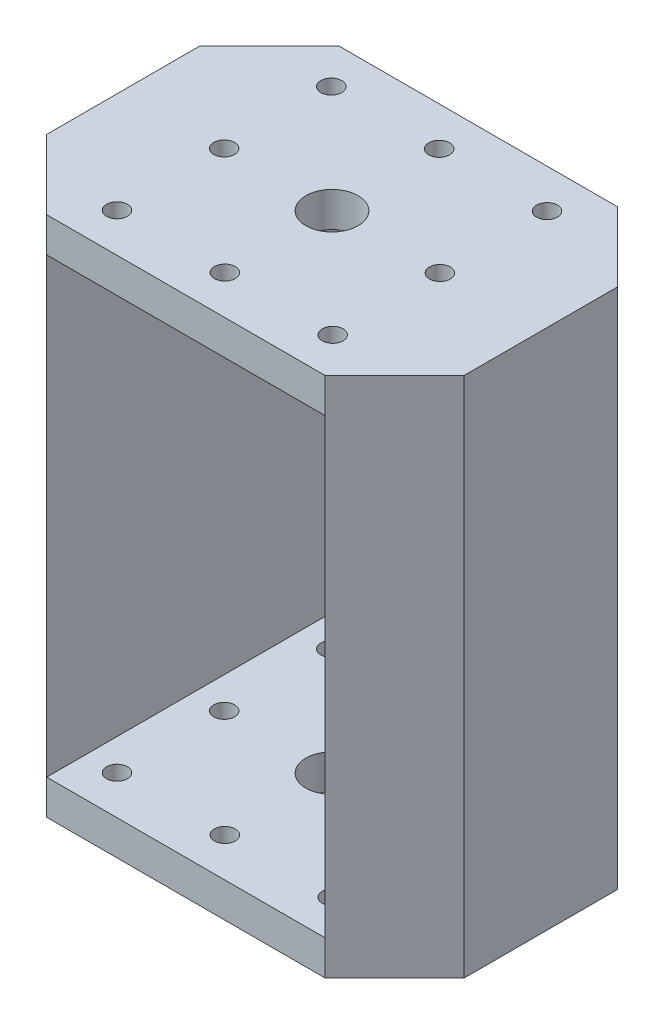
ISO-10303-21;
HEADER;
FILE_DESCRIPTION(('STEP AP214'),'2;1');
FILE_NAME('part.step','',(''),(''),'','','');
FILE_SCHEMA(('AUTOMOTIVE_DESIGN { 1 0 10303 214 1 1 1 1 }'));
ENDSEC;
DATA;
#1=APPLICATION_CONTEXT('core data for automotive mechanical design processes');
#2=APPLICATION_PROTOCOL_DEFINITION('international standard','automotive_design',2000,#1);
#3=PRODUCT_CONTEXT('',#1,'mechanical');
#4=PRODUCT('Part','Part','',(#3));
#5=PRODUCT_RELATED_PRODUCT_CATEGORY('part','',(#4));
#6=PRODUCT_DEFINITION_FORMATION('','',#4);
#7=PRODUCT_DEFINITION_CONTEXT('part definition',#1,'design');
#8=PRODUCT_DEFINITION('design','',#6,#7);
#9=PRODUCT_DEFINITION_SHAPE('','',#8);
#10=(LENGTH_UNIT() NAMED_UNIT(*) SI_UNIT(.MILLI.,.METRE.));
#11=(NAMED_UNIT(*) PLANE_ANGLE_UNIT() SI_UNIT($,.RADIAN.));
#12=(NAMED_UNIT(*) SI_UNIT($,.STERADIAN.) SOLID_ANGLE_UNIT());
#13=UNCERTAINTY_MEASURE_WITH_UNIT(LENGTH_MEASURE(1.E-05),#10,'distance_accuracy_value','');
#14=(GEOMETRIC_REPRESENTATION_CONTEXT(3) GLOBAL_UNCERTAINTY_ASSIGNED_CONTEXT((#13)) GLOBAL_UNIT_ASSIGNED_CONTEXT((#10,
#11,#12)) REPRESENTATION_CONTEXT('',''));
#15=CARTESIAN_POINT('',(0.,0.,0.));
#16=DIRECTION('',(0.,0.,1.));
#17=DIRECTION('',(1.,0.,0.));
#18=AXIS2_PLACEMENT_3D('',#15,#16,#17);
#19=CARTESIAN_POINT('',(0.,75.,0.));
#20=DIRECTION('',(0.,0.,-1.));
#21=DIRECTION('',(-1.,0.,0.));
#22=AXIS2_PLACEMENT_3D('',#19,#20,#21);
#23=PLANE('',#22);
#24=DIRECTION('',(1.,0.,0.));
#25=VECTOR('',#24,1.);
#26=CARTESIAN_POINT('',(0.,0.,0.));
#27=LINE('',#26,#25);
#28=CARTESIAN_POINT('',(9.99999999999999,0.,0.));
#29=VERTEX_POINT('',#28);
#30=CARTESIAN_POINT('',(50.,0.,0.));
#31=VERTEX_POINT('',#30);
#32=EDGE_CURVE('E247',#29,#31,#27,.T.);
#33=ORIENTED_EDGE('',*,*,#32,.T.);
#34=DIRECTION('',(0.,1.,0.));
#35=VECTOR('',#34,1.);
#36=CARTESIAN_POINT('',(50.,75.,0.));
#37=LINE('',#36,#35);
#38=CARTESIAN_POINT('',(50.,5.,0.));
#39=VERTEX_POINT('',#38);
#40=EDGE_CURVE('E227',#31,#39,#37,.T.);
#41=ORIENTED_EDGE('',*,*,#40,.T.);
#42=DIRECTION('',(-1.,0.,0.));
#43=VECTOR('',#42,1.);
#44=CARTESIAN_POINT('',(0.,5.,0.));
#45=LINE('',#44,#43);
#46=CARTESIAN_POINT('',(10.,5.,0.));
#47=VERTEX_POINT('',#46);
#48=EDGE_CURVE('E272',#39,#47,#45,.T.);
#49=ORIENTED_EDGE('',*,*,#48,.T.);
#50=DIRECTION('',(0.,-1.,0.));
#51=VECTOR('',#50,1.);
#52=CARTESIAN_POINT('',(9.99999999999999,75.,0.));
#53=LINE('',#52,#51);
#54=EDGE_CURVE('E218',#47,#29,#53,.T.);
#55=ORIENTED_EDGE('',*,*,#54,.T.);
#56=EDGE_LOOP('',(#33,#41,#49,#55));
#57=FACE_BOUND('',#56,.T.);
#58=ADVANCED_FACE('F47',(#57),#23,.F.);
#59=CARTESIAN_POINT('',(0.,75.,-42.));
#60=DIRECTION('',(0.,0.,1.));
#61=DIRECTION('',(1.,0.,0.));
#62=AXIS2_PLACEMENT_3D('',#59,#60,#61);
#63=PLANE('',#62);
#64=DIRECTION('',(-1.,0.,0.));
#65=VECTOR('',#64,1.);
#66=CARTESIAN_POINT('',(0.,75.,-42.));
#67=LINE('',#66,#65);
#68=CARTESIAN_POINT('',(50.,75.,-42.));
#69=VERTEX_POINT('',#68);
#70=CARTESIAN_POINT('',(10.,75.,-42.));
#71=VERTEX_POINT('',#70);
#72=EDGE_CURVE('E290',#69,#71,#67,.T.);
#73=ORIENTED_EDGE('',*,*,#72,.F.);
#74=DIRECTION('',(0.,-1.,0.));
#75=VECTOR('',#74,1.);
#76=CARTESIAN_POINT('',(50.,75.,-42.));
#77=LINE('',#76,#75);
#78=CARTESIAN_POINT('',(50.,70.,-42.));
#79=VERTEX_POINT('',#78);
#80=EDGE_CURVE('E146',#69,#79,#77,.T.);
#81=ORIENTED_EDGE('',*,*,#80,.T.);
#82=DIRECTION('',(1.,0.,0.));
#83=VECTOR('',#82,1.);
#84=CARTESIAN_POINT('',(60.,70.,-42.));
#85=LINE('',#84,#83);
#86=CARTESIAN_POINT('',(10.,70.,-42.));
#87=VERTEX_POINT('',#86);
#88=EDGE_CURVE('E138',#87,#79,#85,.T.);
#89=ORIENTED_EDGE('',*,*,#88,.F.);
#90=DIRECTION('',(0.,1.,0.));
#91=VECTOR('',#90,1.);
#92=CARTESIAN_POINT('',(10.,75.,-42.));
#93=LINE('',#92,#91);
#94=EDGE_CURVE('E143',#87,#71,#93,.T.);
#95=ORIENTED_EDGE('',*,*,#94,.T.);
#96=EDGE_LOOP('',(#73,#81,#89,#95));
#97=FACE_BOUND('',#96,.T.);
#98=ADVANCED_FACE('F141',(#97),#63,.F.);
#99=CARTESIAN_POINT('',(60.,70.,0.));
#100=DIRECTION('',(0.,1.,0.));
#101=DIRECTION('',(0.,0.,1.));
#102=AXIS2_PLACEMENT_3D('',#99,#100,#101);
#103=PLANE('',#102);
#104=CARTESIAN_POINT('',(14.5,70.,-21.));
#105=DIRECTION('',(0.,1.,0.));
#106=DIRECTION('',(0.,0.,1.));
#107=AXIS2_PLACEMENT_3D('',#104,#105,#106);
#108=CIRCLE('',#107,1.5);
#109=CARTESIAN_POINT('',(14.5,70.,-19.5));
#110=VERTEX_POINT('',#109);
#111=EDGE_CURVE('E151',#110,#110,#108,.T.);
#112=ORIENTED_EDGE('',*,*,#111,.T.);
#113=EDGE_LOOP('',(#112));
#114=FACE_BOUND('',#113,.T.);
#115=CARTESIAN_POINT('',(30.,70.,-5.6));
#116=DIRECTION('',(0.,1.,0.));
#117=DIRECTION('',(0.,0.,1.));
#118=AXIS2_PLACEMENT_3D('',#115,#116,#117);
#119=CIRCLE('',#118,1.5);
#120=CARTESIAN_POINT('',(30.,70.,-4.1));
#121=VERTEX_POINT('',#120);
#122=EDGE_CURVE('E289',#121,#121,#119,.T.);
#123=ORIENTED_EDGE('',*,*,#122,.T.);
#124=EDGE_LOOP('',(#123));
#125=FACE_BOUND('',#124,.T.);
#126=CARTESIAN_POINT('',(45.5,70.,-21.));
#127=DIRECTION('',(0.,1.,0.));
#128=DIRECTION('',(0.,0.,1.));
#129=AXIS2_PLACEMENT_3D('',#126,#127,#128);
#130=CIRCLE('',#129,1.5);
#131=CARTESIAN_POINT('',(45.5,70.,-19.5));
#132=VERTEX_POINT('',#131);
#133=EDGE_CURVE('E362',#132,#132,#130,.T.);
#134=ORIENTED_EDGE('',*,*,#133,.T.);
#135=EDGE_LOOP('',(#134));
#136=FACE_BOUND('',#135,.T.);
#137=CARTESIAN_POINT('',(30.,70.,-36.4));
#138=DIRECTION('',(0.,1.,0.));
#139=DIRECTION('',(0.,0.,1.));
#140=AXIS2_PLACEMENT_3D('',#137,#138,#139);
#141=CIRCLE('',#140,1.49999999999999);
#142=CARTESIAN_POINT('',(30.,70.,-34.9));
#143=VERTEX_POINT('',#142);
#144=EDGE_CURVE('E358',#143,#143,#141,.T.);
#145=ORIENTED_EDGE('',*,*,#144,.T.);
#146=EDGE_LOOP('',(#145));
#147=FACE_BOUND('',#146,.T.);
#148=CARTESIAN_POINT('',(14.5,70.,-5.6));
#149=DIRECTION('',(0.,1.,0.));
#150=DIRECTION('',(0.,0.,1.));
#151=AXIS2_PLACEMENT_3D('',#148,#149,#150);
#152=CIRCLE('',#151,1.5);
#153=CARTESIAN_POINT('',(14.5,70.,-4.1));
#154=VERTEX_POINT('',#153);
#155=EDGE_CURVE('E354',#154,#154,#152,.T.);
#156=ORIENTED_EDGE('',*,*,#155,.T.);
#157=EDGE_LOOP('',(#156));
#158=FACE_BOUND('',#157,.T.);
#159=CARTESIAN_POINT('',(45.5,70.,-5.6));
#160=DIRECTION('',(0.,1.,0.));
#161=DIRECTION('',(0.,0.,1.));
#162=AXIS2_PLACEMENT_3D('',#159,#160,#161);
#163=CIRCLE('',#162,1.5);
#164=CARTESIAN_POINT('',(45.5,70.,-4.1));
#165=VERTEX_POINT('',#164);
#166=EDGE_CURVE('E350',#165,#165,#163,.T.);
#167=ORIENTED_EDGE('',*,*,#166,.T.);
#168=EDGE_LOOP('',(#167));
#169=FACE_BOUND('',#168,.T.);
#170=CARTESIAN_POINT('',(45.5,70.,-36.4));
#171=DIRECTION('',(0.,1.,0.));
#172=DIRECTION('',(0.,0.,1.));
#173=AXIS2_PLACEMENT_3D('',#170,#171,#172);
#174=CIRCLE('',#173,1.5);
#175=CARTESIAN_POINT('',(45.5,70.,-34.9));
#176=VERTEX_POINT('',#175);
#177=EDGE_CURVE('E346',#176,#176,#174,.T.);
#178=ORIENTED_EDGE('',*,*,#177,.T.);
#179=EDGE_LOOP('',(#178));
#180=FACE_BOUND('',#179,.T.);
#181=CARTESIAN_POINT('',(14.5,70.,-36.4));
#182=DIRECTION('',(0.,1.,0.));
#183=DIRECTION('',(0.,0.,1.));
#184=AXIS2_PLACEMENT_3D('',#181,#182,#183);
#185=CIRCLE('',#184,1.5);
#186=CARTESIAN_POINT('',(14.5,70.,-34.9));
#187=VERTEX_POINT('',#186);
#188=EDGE_CURVE('E342',#187,#187,#185,.T.);
#189=ORIENTED_EDGE('',*,*,#188,.T.);
#190=EDGE_LOOP('',(#189));
#191=FACE_BOUND('',#190,.T.);
#192=CARTESIAN_POINT('',(30.,70.,-21.));
#193=DIRECTION('',(0.,1.,0.));
#194=DIRECTION('',(0.,0.,1.));
#195=AXIS2_PLACEMENT_3D('',#192,#193,#194);
#196=CIRCLE('',#195,3.75000000000001);
#197=CARTESIAN_POINT('',(30.,70.,-17.25));
#198=VERTEX_POINT('',#197);
#199=EDGE_CURVE('E293',#198,#198,#196,.T.);
#200=ORIENTED_EDGE('',*,*,#199,.T.);
#201=EDGE_LOOP('',(#200));
#202=FACE_BOUND('',#201,.T.);
#203=DIRECTION('',(1.,0.,0.));
#204=VECTOR('',#203,1.);
#205=CARTESIAN_POINT('',(60.,70.,0.));
#206=LINE('',#205,#204);
#207=CARTESIAN_POINT('',(10.,70.,0.));
#208=VERTEX_POINT('',#207);
#209=CARTESIAN_POINT('',(50.,70.,0.));
#210=VERTEX_POINT('',#209);
#211=EDGE_CURVE('E158',#208,#210,#206,.T.);
#212=ORIENTED_EDGE('',*,*,#211,.F.);
#213=DIRECTION('',(0.,0.,1.));
#214=VECTOR('',#213,1.);
#215=CARTESIAN_POINT('',(10.,70.,-42.));
#216=LINE('',#215,#214);
#217=EDGE_CURVE('E155',#87,#208,#216,.T.);
#218=ORIENTED_EDGE('',*,*,#217,.F.);
#219=ORIENTED_EDGE('',*,*,#88,.T.);
#220=DIRECTION('',(0.,0.,-1.));
#221=VECTOR('',#220,1.);
#222=CARTESIAN_POINT('',(50.,70.,0.));
#223=LINE('',#222,#221);
#224=EDGE_CURVE('E283',#210,#79,#223,.T.);
#225=ORIENTED_EDGE('',*,*,#224,.F.);
#226=EDGE_LOOP('',(#212,#218,#219,#225));
#227=FACE_BOUND('',#226,.T.);
#228=ADVANCED_FACE('F157',(#114,#125,#136,#147,#158,#169,#180,#191,#202,#227),#103,.F.);
#229=CARTESIAN_POINT('',(0.,75.,0.));
#230=DIRECTION('',(1.,0.,0.));
#231=DIRECTION('',(0.,0.,-1.));
#232=AXIS2_PLACEMENT_3D('',#229,#230,#231);
#233=PLANE('',#232);
#234=DIRECTION('',(0.,0.,1.));
#235=VECTOR('',#234,1.);
#236=CARTESIAN_POINT('',(0.,0.,0.));
#237=LINE('',#236,#235);
#238=CARTESIAN_POINT('',(0.,0.,-32.));
#239=VERTEX_POINT('',#238);
#240=CARTESIAN_POINT('',(0.,0.,-10.));
#241=VERTEX_POINT('',#240);
#242=EDGE_CURVE('E236',#239,#241,#237,.T.);
#243=ORIENTED_EDGE('',*,*,#242,.T.);
#244=DIRECTION('',(0.,1.,0.));
#245=VECTOR('',#244,1.);
#246=CARTESIAN_POINT('',(0.,75.,-10.));
#247=LINE('',#246,#245);
#248=CARTESIAN_POINT('',(0.,75.,-10.));
#249=VERTEX_POINT('',#248);
#250=EDGE_CURVE('E11',#241,#249,#247,.T.);
#251=ORIENTED_EDGE('',*,*,#250,.T.);
#252=DIRECTION('',(0.,0.,1.));
#253=VECTOR('',#252,1.);
#254=CARTESIAN_POINT('',(0.,75.,0.));
#255=LINE('',#254,#253);
#256=CARTESIAN_POINT('',(0.,75.,-32.));
#257=VERTEX_POINT('',#256);
#258=EDGE_CURVE('E238',#257,#249,#255,.T.);
#259=ORIENTED_EDGE('',*,*,#258,.F.);
#260=DIRECTION('',(0.,-1.,0.));
#261=VECTOR('',#260,1.);
#262=CARTESIAN_POINT('',(0.,75.,-32.));
#263=LINE('',#262,#261);
#264=EDGE_CURVE('E57',#257,#239,#263,.T.);
#265=ORIENTED_EDGE('',*,*,#264,.T.);
#266=EDGE_LOOP('',(#243,#251,#259,#265));
#267=FACE_BOUND('',#266,.T.);
#268=ADVANCED_FACE('F235',(#267),#233,.F.);
#269=ORIENTED_EDGE('',*,*,#211,.T.);
#270=DIRECTION('',(0.,1.,0.));
#271=VECTOR('',#270,1.);
#272=CARTESIAN_POINT('',(50.,75.,0.));
#273=LINE('',#272,#271);
#274=CARTESIAN_POINT('',(50.,75.,0.));
#275=VERTEX_POINT('',#274);
#276=EDGE_CURVE('E64',#210,#275,#273,.T.);
#277=ORIENTED_EDGE('',*,*,#276,.T.);
#278=DIRECTION('',(1.,0.,0.));
#279=VECTOR('',#278,1.);
#280=CARTESIAN_POINT('',(0.,75.,0.));
#281=LINE('',#280,#279);
#282=CARTESIAN_POINT('',(9.99999999999999,75.,0.));
#283=VERTEX_POINT('',#282);
#284=EDGE_CURVE('E298',#283,#275,#281,.T.);
#285=ORIENTED_EDGE('',*,*,#284,.F.);
#286=DIRECTION('',(0.,-1.,0.));
#287=VECTOR('',#286,1.);
#288=CARTESIAN_POINT('',(9.99999999999999,75.,0.));
#289=LINE('',#288,#287);
#290=EDGE_CURVE('E221',#283,#208,#289,.T.);
#291=ORIENTED_EDGE('',*,*,#290,.T.);
#292=EDGE_LOOP('',(#269,#277,#285,#291));
#293=FACE_BOUND('',#292,.T.);
#294=ADVANCED_FACE('F397',(#293),#23,.F.);
#295=CARTESIAN_POINT('',(60.,75.,0.));
#296=DIRECTION('',(-1.,0.,0.));
#297=DIRECTION('',(0.,0.,1.));
#298=AXIS2_PLACEMENT_3D('',#295,#296,#297);
#299=PLANE('',#298);
#300=DIRECTION('',(0.,0.,-1.));
#301=VECTOR('',#300,1.);
#302=CARTESIAN_POINT('',(60.,0.,0.));
#303=LINE('',#302,#301);
#304=CARTESIAN_POINT('',(60.,0.,-9.99999999999999));
#305=VERTEX_POINT('',#304);
#306=CARTESIAN_POINT('',(60.,0.,-32.));
#307=VERTEX_POINT('',#306);
#308=EDGE_CURVE('E253',#305,#307,#303,.T.);
#309=ORIENTED_EDGE('',*,*,#308,.T.);
#310=DIRECTION('',(0.,1.,0.));
#311=VECTOR('',#310,1.);
#312=CARTESIAN_POINT('',(60.,75.,-32.));
#313=LINE('',#312,#311);
#314=CARTESIAN_POINT('',(60.,75.,-32.));
#315=VERTEX_POINT('',#314);
#316=EDGE_CURVE('E205',#307,#315,#313,.T.);
#317=ORIENTED_EDGE('',*,*,#316,.T.);
#318=DIRECTION('',(0.,0.,-1.));
#319=VECTOR('',#318,1.);
#320=CARTESIAN_POINT('',(60.,75.,0.));
#321=LINE('',#320,#319);
#322=CARTESIAN_POINT('',(60.,75.,-9.99999999999999));
#323=VERTEX_POINT('',#322);
#324=EDGE_CURVE('E294',#323,#315,#321,.T.);
#325=ORIENTED_EDGE('',*,*,#324,.F.);
#326=DIRECTION('',(0.,-1.,0.));
#327=VECTOR('',#326,1.);
#328=CARTESIAN_POINT('',(60.,75.,-9.99999999999999));
#329=LINE('',#328,#327);
#330=EDGE_CURVE('E201',#323,#305,#329,.T.);
#331=ORIENTED_EDGE('',*,*,#330,.T.);
#332=EDGE_LOOP('',(#309,#317,#325,#331));
#333=FACE_BOUND('',#332,.T.);
#334=ADVANCED_FACE('F406',(#333),#299,.F.);
#335=DIRECTION('',(-1.,0.,0.));
#336=VECTOR('',#335,1.);
#337=CARTESIAN_POINT('',(0.,5.,-42.));
#338=LINE('',#337,#336);
#339=CARTESIAN_POINT('',(50.,5.,-42.));
#340=VERTEX_POINT('',#339);
#341=CARTESIAN_POINT('',(10.,5.,-42.));
#342=VERTEX_POINT('',#341);
#343=EDGE_CURVE('E440',#340,#342,#338,.T.);
#344=ORIENTED_EDGE('',*,*,#343,.F.);
#345=DIRECTION('',(0.,-1.,0.));
#346=VECTOR('',#345,1.);
#347=CARTESIAN_POINT('',(50.,75.,-42.));
#348=LINE('',#347,#346);
#349=CARTESIAN_POINT('',(50.,0.,-42.));
#350=VERTEX_POINT('',#349);
#351=EDGE_CURVE('E181',#340,#350,#348,.T.);
#352=ORIENTED_EDGE('',*,*,#351,.T.);
#353=DIRECTION('',(-1.,0.,0.));
#354=VECTOR('',#353,1.);
#355=CARTESIAN_POINT('',(0.,0.,-42.));
#356=LINE('',#355,#354);
#357=CARTESIAN_POINT('',(10.,0.,-42.));
#358=VERTEX_POINT('',#357);
#359=EDGE_CURVE('E263',#350,#358,#356,.T.);
#360=ORIENTED_EDGE('',*,*,#359,.T.);
#361=DIRECTION('',(0.,1.,0.));
#362=VECTOR('',#361,1.);
#363=CARTESIAN_POINT('',(10.,75.,-42.));
#364=LINE('',#363,#362);
#365=EDGE_CURVE('E178',#358,#342,#364,.T.);
#366=ORIENTED_EDGE('',*,*,#365,.T.);
#367=EDGE_LOOP('',(#344,#352,#360,#366));
#368=FACE_BOUND('',#367,.T.);
#369=ADVANCED_FACE('F402',(#368),#63,.F.);
#370=CARTESIAN_POINT('',(30.,75.,-21.));
#371=DIRECTION('',(0.,-1.,0.));
#372=DIRECTION('',(0.,0.,-1.));
#373=AXIS2_PLACEMENT_3D('',#370,#371,#372);
#374=CYLINDRICAL_SURFACE('',#373,3.75000000000001);
#375=ORIENTED_EDGE('',*,*,#199,.F.);
#376=EDGE_LOOP('',(#375));
#377=FACE_BOUND('',#376,.T.);
#378=CARTESIAN_POINT('',(30.,75.,-21.));
#379=DIRECTION('',(0.,1.,0.));
#380=DIRECTION('',(0.,0.,1.));
#381=AXIS2_PLACEMENT_3D('',#378,#379,#380);
#382=CIRCLE('',#381,3.75000000000001);
#383=CARTESIAN_POINT('',(30.,75.,-17.25));
#384=VERTEX_POINT('',#383);
#385=EDGE_CURVE('E304',#384,#384,#382,.T.);
#386=ORIENTED_EDGE('',*,*,#385,.T.);
#387=EDGE_LOOP('',(#386));
#388=FACE_BOUND('',#387,.T.);
#389=ADVANCED_FACE('F553',(#377,#388),#374,.F.);
#390=CARTESIAN_POINT('',(14.5,75.,-36.4));
#391=DIRECTION('',(0.,-1.,0.));
#392=DIRECTION('',(0.,0.,-1.));
#393=AXIS2_PLACEMENT_3D('',#390,#391,#392);
#394=CYLINDRICAL_SURFACE('',#393,1.5);
#395=ORIENTED_EDGE('',*,*,#188,.F.);
#396=EDGE_LOOP('',(#395));
#397=FACE_BOUND('',#396,.T.);
#398=CARTESIAN_POINT('',(14.5,75.,-36.4));
#399=DIRECTION('',(0.,1.,0.));
#400=DIRECTION('',(0.,0.,1.));
#401=AXIS2_PLACEMENT_3D('',#398,#399,#400);
#402=CIRCLE('',#401,1.5);
#403=CARTESIAN_POINT('',(14.5,75.,-34.9));
#404=VERTEX_POINT('',#403);
#405=EDGE_CURVE('E308',#404,#404,#402,.T.);
#406=ORIENTED_EDGE('',*,*,#405,.T.);
#407=EDGE_LOOP('',(#406));
#408=FACE_BOUND('',#407,.T.);
#409=ADVANCED_FACE('F551',(#397,#408),#394,.F.);
#410=CARTESIAN_POINT('',(45.5,75.,-36.4));
#411=DIRECTION('',(0.,-1.,0.));
#412=DIRECTION('',(0.,0.,-1.));
#413=AXIS2_PLACEMENT_3D('',#410,#411,#412);
#414=CYLINDRICAL_SURFACE('',#413,1.5);
#415=ORIENTED_EDGE('',*,*,#177,.F.);
#416=EDGE_LOOP('',(#415));
#417=FACE_BOUND('',#416,.T.);
#418=CARTESIAN_POINT('',(45.5,75.,-36.4));
#419=DIRECTION('',(0.,1.,0.));
#420=DIRECTION('',(0.,0.,1.));
#421=AXIS2_PLACEMENT_3D('',#418,#419,#420);
#422=CIRCLE('',#421,1.5);
#423=CARTESIAN_POINT('',(45.5,75.,-34.9));
#424=VERTEX_POINT('',#423);
#425=EDGE_CURVE('E312',#424,#424,#422,.T.);
#426=ORIENTED_EDGE('',*,*,#425,.T.);
#427=EDGE_LOOP('',(#426));
#428=FACE_BOUND('',#427,.T.);
#429=ADVANCED_FACE('F548',(#417,#428),#414,.F.);
#430=CARTESIAN_POINT('',(45.5,75.,-5.6));
#431=DIRECTION('',(0.,-1.,0.));
#432=DIRECTION('',(0.,0.,-1.));
#433=AXIS2_PLACEMENT_3D('',#430,#431,#432);
#434=CYLINDRICAL_SURFACE('',#433,1.5);
#435=ORIENTED_EDGE('',*,*,#166,.F.);
#436=EDGE_LOOP('',(#435));
#437=FACE_BOUND('',#436,.T.);
#438=CARTESIAN_POINT('',(45.5,75.,-5.6));
#439=DIRECTION('',(0.,1.,0.));
#440=DIRECTION('',(0.,0.,1.));
#441=AXIS2_PLACEMENT_3D('',#438,#439,#440);
#442=CIRCLE('',#441,1.5);
#443=CARTESIAN_POINT('',(45.5,75.,-4.1));
#444=VERTEX_POINT('',#443);
#445=EDGE_CURVE('E316',#444,#444,#442,.T.);
#446=ORIENTED_EDGE('',*,*,#445,.T.);
#447=EDGE_LOOP('',(#446));
#448=FACE_BOUND('',#447,.T.);
#449=ADVANCED_FACE('F546',(#437,#448),#434,.F.);
#450=CARTESIAN_POINT('',(14.5,75.,-5.6));
#451=DIRECTION('',(0.,-1.,0.));
#452=DIRECTION('',(0.,0.,-1.));
#453=AXIS2_PLACEMENT_3D('',#450,#451,#452);
#454=CYLINDRICAL_SURFACE('',#453,1.5);
#455=ORIENTED_EDGE('',*,*,#155,.F.);
#456=EDGE_LOOP('',(#455));
#457=FACE_BOUND('',#456,.T.);
#458=CARTESIAN_POINT('',(14.5,75.,-5.6));
#459=DIRECTION('',(0.,1.,0.));
#460=DIRECTION('',(0.,0.,1.));
#461=AXIS2_PLACEMENT_3D('',#458,#459,#460);
#462=CIRCLE('',#461,1.5);
#463=CARTESIAN_POINT('',(14.5,75.,-4.1));
#464=VERTEX_POINT('',#463);
#465=EDGE_CURVE('E320',#464,#464,#462,.T.);
#466=ORIENTED_EDGE('',*,*,#465,.T.);
#467=EDGE_LOOP('',(#466));
#468=FACE_BOUND('',#467,.T.);
#469=ADVANCED_FACE('F543',(#457,#468),#454,.F.);
#470=CARTESIAN_POINT('',(30.,75.,-36.4));
#471=DIRECTION('',(0.,-1.,0.));
#472=DIRECTION('',(0.,0.,-1.));
#473=AXIS2_PLACEMENT_3D('',#470,#471,#472);
#474=CYLINDRICAL_SURFACE('',#473,1.49999999999999);
#475=ORIENTED_EDGE('',*,*,#144,.F.);
#476=EDGE_LOOP('',(#475));
#477=FACE_BOUND('',#476,.T.);
#478=CARTESIAN_POINT('',(30.,75.,-36.4));
#479=DIRECTION('',(0.,1.,0.));
#480=DIRECTION('',(0.,0.,1.));
#481=AXIS2_PLACEMENT_3D('',#478,#479,#480);
#482=CIRCLE('',#481,1.49999999999999);
#483=CARTESIAN_POINT('',(30.,75.,-34.9));
#484=VERTEX_POINT('',#483);
#485=EDGE_CURVE('E324',#484,#484,#482,.T.);
#486=ORIENTED_EDGE('',*,*,#485,.T.);
#487=EDGE_LOOP('',(#486));
#488=FACE_BOUND('',#487,.T.);
#489=ADVANCED_FACE('F541',(#477,#488),#474,.F.);
#490=CARTESIAN_POINT('',(45.5,75.,-21.));
#491=DIRECTION('',(0.,-1.,0.));
#492=DIRECTION('',(0.,0.,-1.));
#493=AXIS2_PLACEMENT_3D('',#490,#491,#492);
#494=CYLINDRICAL_SURFACE('',#493,1.5);
#495=ORIENTED_EDGE('',*,*,#133,.F.);
#496=EDGE_LOOP('',(#495));
#497=FACE_BOUND('',#496,.T.);
#498=CARTESIAN_POINT('',(45.5,75.,-21.));
#499=DIRECTION('',(0.,1.,0.));
#500=DIRECTION('',(0.,0.,1.));
#501=AXIS2_PLACEMENT_3D('',#498,#499,#500);
#502=CIRCLE('',#501,1.5);
#503=CARTESIAN_POINT('',(45.5,75.,-19.5));
#504=VERTEX_POINT('',#503);
#505=EDGE_CURVE('E328',#504,#504,#502,.T.);
#506=ORIENTED_EDGE('',*,*,#505,.T.);
#507=EDGE_LOOP('',(#506));
#508=FACE_BOUND('',#507,.T.);
#509=ADVANCED_FACE('F376',(#497,#508),#494,.F.);
#510=CARTESIAN_POINT('',(30.,75.,-5.6));
#511=DIRECTION('',(0.,-1.,0.));
#512=DIRECTION('',(0.,0.,-1.));
#513=AXIS2_PLACEMENT_3D('',#510,#511,#512);
#514=CYLINDRICAL_SURFACE('',#513,1.5);
#515=ORIENTED_EDGE('',*,*,#122,.F.);
#516=EDGE_LOOP('',(#515));
#517=FACE_BOUND('',#516,.T.);
#518=CARTESIAN_POINT('',(30.,75.,-5.6));
#519=DIRECTION('',(0.,1.,0.));
#520=DIRECTION('',(0.,0.,1.));
#521=AXIS2_PLACEMENT_3D('',#518,#519,#520);
#522=CIRCLE('',#521,1.5);
#523=CARTESIAN_POINT('',(30.,75.,-4.1));
#524=VERTEX_POINT('',#523);
#525=EDGE_CURVE('E332',#524,#524,#522,.T.);
#526=ORIENTED_EDGE('',*,*,#525,.T.);
#527=EDGE_LOOP('',(#526));
#528=FACE_BOUND('',#527,.T.);
#529=ADVANCED_FACE('F372',(#517,#528),#514,.F.);
#530=CARTESIAN_POINT('',(14.5,75.,-21.));
#531=DIRECTION('',(0.,-1.,0.));
#532=DIRECTION('',(0.,0.,-1.));
#533=AXIS2_PLACEMENT_3D('',#530,#531,#532);
#534=CYLINDRICAL_SURFACE('',#533,1.5);
#535=ORIENTED_EDGE('',*,*,#111,.F.);
#536=EDGE_LOOP('',(#535));
#537=FACE_BOUND('',#536,.T.);
#538=CARTESIAN_POINT('',(14.5,75.,-21.));
#539=DIRECTION('',(0.,1.,0.));
#540=DIRECTION('',(0.,0.,1.));
#541=AXIS2_PLACEMENT_3D('',#538,#539,#540);
#542=CIRCLE('',#541,1.5);
#543=CARTESIAN_POINT('',(14.5,75.,-19.5));
#544=VERTEX_POINT('',#543);
#545=EDGE_CURVE('E303',#544,#544,#542,.T.);
#546=ORIENTED_EDGE('',*,*,#545,.T.);
#547=EDGE_LOOP('',(#546));
#548=FACE_BOUND('',#547,.T.);
#549=ADVANCED_FACE('F375',(#537,#548),#534,.F.);
#550=CARTESIAN_POINT('',(0.,75.,0.));
#551=DIRECTION('',(0.,-1.,0.));
#552=DIRECTION('',(0.,0.,-1.));
#553=AXIS2_PLACEMENT_3D('',#550,#551,#552);
#554=PLANE('',#553);
#555=ORIENTED_EDGE('',*,*,#324,.T.);
#556=DIRECTION('',(0.707106781186546,0.,0.707106781186549));
#557=VECTOR('',#556,1.);
#558=CARTESIAN_POINT('',(50.,75.,-42.));
#559=LINE('',#558,#557);
#560=EDGE_CURVE('E215',#315,#69,#559,.F.);
#561=ORIENTED_EDGE('',*,*,#560,.T.);
#562=ORIENTED_EDGE('',*,*,#72,.T.);
#563=DIRECTION('',(0.707106781186549,0.,-0.707106781186546));
#564=VECTOR('',#563,1.);
#565=CARTESIAN_POINT('',(0.,75.,-32.));
#566=LINE('',#565,#564);
#567=EDGE_CURVE('E176',#71,#257,#566,.F.);
#568=ORIENTED_EDGE('',*,*,#567,.T.);
#569=ORIENTED_EDGE('',*,*,#258,.T.);
#570=DIRECTION('',(-0.707106781186546,0.,-0.707106781186549));
#571=VECTOR('',#570,1.);
#572=CARTESIAN_POINT('',(9.99999999999999,75.,0.));
#573=LINE('',#572,#571);
#574=EDGE_CURVE('E71',#249,#283,#573,.F.);
#575=ORIENTED_EDGE('',*,*,#574,.T.);
#576=ORIENTED_EDGE('',*,*,#284,.T.);
#577=DIRECTION('',(-0.707106781186549,0.,0.707106781186546));
#578=VECTOR('',#577,1.);
#579=CARTESIAN_POINT('',(60.,75.,-9.99999999999999));
#580=LINE('',#579,#578);
#581=EDGE_CURVE('E212',#275,#323,#580,.F.);
#582=ORIENTED_EDGE('',*,*,#581,.T.);
#583=EDGE_LOOP('',(#555,#561,#562,#568,#569,#575,#576,#582));
#584=FACE_BOUND('',#583,.T.);
#585=ORIENTED_EDGE('',*,*,#385,.F.);
#586=EDGE_LOOP('',(#585));
#587=FACE_BOUND('',#586,.T.);
#588=ORIENTED_EDGE('',*,*,#405,.F.);
#589=EDGE_LOOP('',(#588));
#590=FACE_BOUND('',#589,.T.);
#591=ORIENTED_EDGE('',*,*,#425,.F.);
#592=EDGE_LOOP('',(#591));
#593=FACE_BOUND('',#592,.T.);
#594=ORIENTED_EDGE('',*,*,#445,.F.);
#595=EDGE_LOOP('',(#594));
#596=FACE_BOUND('',#595,.T.);
#597=ORIENTED_EDGE('',*,*,#465,.F.);
#598=EDGE_LOOP('',(#597));
#599=FACE_BOUND('',#598,.T.);
#600=ORIENTED_EDGE('',*,*,#485,.F.);
#601=EDGE_LOOP('',(#600));
#602=FACE_BOUND('',#601,.T.);
#603=ORIENTED_EDGE('',*,*,#505,.F.);
#604=EDGE_LOOP('',(#603));
#605=FACE_BOUND('',#604,.T.);
#606=ORIENTED_EDGE('',*,*,#525,.F.);
#607=EDGE_LOOP('',(#606));
#608=FACE_BOUND('',#607,.T.);
#609=ORIENTED_EDGE('',*,*,#545,.F.);
#610=EDGE_LOOP('',(#609));
#611=FACE_BOUND('',#610,.T.);
#612=ADVANCED_FACE('F380',(#584,#587,#590,#593,#596,#599,#602,#605,#608,#611),#554,.F.);
#613=CARTESIAN_POINT('',(50.,75.002,0.));
#614=DIRECTION('',(-1.,0.,0.));
#615=DIRECTION('',(0.,0.,1.));
#616=AXIS2_PLACEMENT_3D('',#613,#614,#615);
#617=PLANE('',#616);
#618=DIRECTION('',(0.,-1.,0.));
#619=VECTOR('',#618,1.);
#620=CARTESIAN_POINT('',(50.,75.002,0.));
#621=LINE('',#620,#619);
#622=EDGE_CURVE('E279',#210,#39,#621,.T.);
#623=ORIENTED_EDGE('',*,*,#622,.F.);
#624=ORIENTED_EDGE('',*,*,#224,.T.);
#625=DIRECTION('',(0.,-1.,0.));
#626=VECTOR('',#625,1.);
#627=CARTESIAN_POINT('',(50.,75.002,-42.));
#628=LINE('',#627,#626);
#629=EDGE_CURVE('E276',#79,#340,#628,.T.);
#630=ORIENTED_EDGE('',*,*,#629,.T.);
#631=DIRECTION('',(0.,0.,-1.));
#632=VECTOR('',#631,1.);
#633=CARTESIAN_POINT('',(50.,5.,0.));
#634=LINE('',#633,#632);
#635=EDGE_CURVE('E266',#39,#340,#634,.T.);
#636=ORIENTED_EDGE('',*,*,#635,.F.);
#637=EDGE_LOOP('',(#623,#624,#630,#636));
#638=FACE_BOUND('',#637,.T.);
#639=ADVANCED_FACE('F383',(#638),#617,.T.);
#640=CARTESIAN_POINT('',(0.,5.,0.));
#641=DIRECTION('',(0.,-1.,0.));
#642=DIRECTION('',(0.,0.,-1.));
#643=AXIS2_PLACEMENT_3D('',#640,#641,#642);
#644=PLANE('',#643);
#645=CARTESIAN_POINT('',(30.,5.,-21.));
#646=DIRECTION('',(0.,-1.,0.));
#647=DIRECTION('',(0.,0.,-1.));
#648=AXIS2_PLACEMENT_3D('',#645,#646,#647);
#649=CIRCLE('',#648,3.75000000000001);
#650=CARTESIAN_POINT('',(30.,5.,-24.75));
#651=VERTEX_POINT('',#650);
#652=EDGE_CURVE('E473',#651,#651,#649,.T.);
#653=ORIENTED_EDGE('',*,*,#652,.T.);
#654=EDGE_LOOP('',(#653));
#655=FACE_BOUND('',#654,.T.);
#656=CARTESIAN_POINT('',(14.5,5.,-36.4));
#657=DIRECTION('',(0.,-1.,0.));
#658=DIRECTION('',(0.,0.,-1.));
#659=AXIS2_PLACEMENT_3D('',#656,#657,#658);
#660=CIRCLE('',#659,1.5);
#661=CARTESIAN_POINT('',(14.5,5.,-37.9));
#662=VERTEX_POINT('',#661);
#663=EDGE_CURVE('E469',#662,#662,#660,.T.);
#664=ORIENTED_EDGE('',*,*,#663,.T.);
#665=EDGE_LOOP('',(#664));
#666=FACE_BOUND('',#665,.T.);
#667=CARTESIAN_POINT('',(45.5,5.,-36.4));
#668=DIRECTION('',(0.,-1.,0.));
#669=DIRECTION('',(0.,0.,-1.));
#670=AXIS2_PLACEMENT_3D('',#667,#668,#669);
#671=CIRCLE('',#670,1.5);
#672=CARTESIAN_POINT('',(45.5,5.,-37.9));
#673=VERTEX_POINT('',#672);
#674=EDGE_CURVE('E465',#673,#673,#671,.T.);
#675=ORIENTED_EDGE('',*,*,#674,.T.);
#676=EDGE_LOOP('',(#675));
#677=FACE_BOUND('',#676,.T.);
#678=CARTESIAN_POINT('',(45.5,5.,-5.6));
#679=DIRECTION('',(0.,-1.,0.));
#680=DIRECTION('',(0.,0.,-1.));
#681=AXIS2_PLACEMENT_3D('',#678,#679,#680);
#682=CIRCLE('',#681,1.5);
#683=CARTESIAN_POINT('',(45.5,5.,-7.1));
#684=VERTEX_POINT('',#683);
#685=EDGE_CURVE('E461',#684,#684,#682,.T.);
#686=ORIENTED_EDGE('',*,*,#685,.T.);
#687=EDGE_LOOP('',(#686));
#688=FACE_BOUND('',#687,.T.);
#689=CARTESIAN_POINT('',(14.5,5.,-5.6));
#690=DIRECTION('',(0.,-1.,0.));
#691=DIRECTION('',(0.,0.,-1.));
#692=AXIS2_PLACEMENT_3D('',#689,#690,#691);
#693=CIRCLE('',#692,1.5);
#694=CARTESIAN_POINT('',(14.5,5.,-7.1));
#695=VERTEX_POINT('',#694);
#696=EDGE_CURVE('E457',#695,#695,#693,.T.);
#697=ORIENTED_EDGE('',*,*,#696,.T.);
#698=EDGE_LOOP('',(#697));
#699=FACE_BOUND('',#698,.T.);
#700=CARTESIAN_POINT('',(30.,5.,-36.4));
#701=DIRECTION('',(0.,-1.,0.));
#702=DIRECTION('',(0.,0.,-1.));
#703=AXIS2_PLACEMENT_3D('',#700,#701,#702);
#704=CIRCLE('',#703,1.49999999999999);
#705=CARTESIAN_POINT('',(30.,5.,-37.9));
#706=VERTEX_POINT('',#705);
#707=EDGE_CURVE('E453',#706,#706,#704,.T.);
#708=ORIENTED_EDGE('',*,*,#707,.T.);
#709=EDGE_LOOP('',(#708));
#710=FACE_BOUND('',#709,.T.);
#711=CARTESIAN_POINT('',(45.5,5.,-21.));
#712=DIRECTION('',(0.,-1.,0.));
#713=DIRECTION('',(0.,0.,-1.));
#714=AXIS2_PLACEMENT_3D('',#711,#712,#713);
#715=CIRCLE('',#714,1.5);
#716=CARTESIAN_POINT('',(45.5,5.,-22.5));
#717=VERTEX_POINT('',#716);
#718=EDGE_CURVE('E449',#717,#717,#715,.T.);
#719=ORIENTED_EDGE('',*,*,#718,.T.);
#720=EDGE_LOOP('',(#719));
#721=FACE_BOUND('',#720,.T.);
#722=CARTESIAN_POINT('',(30.,5.,-5.6));
#723=DIRECTION('',(0.,-1.,0.));
#724=DIRECTION('',(0.,0.,-1.));
#725=AXIS2_PLACEMENT_3D('',#722,#723,#724);
#726=CIRCLE('',#725,1.5);
#727=CARTESIAN_POINT('',(30.,5.,-7.1));
#728=VERTEX_POINT('',#727);
#729=EDGE_CURVE('E271',#728,#728,#726,.T.);
#730=ORIENTED_EDGE('',*,*,#729,.T.);
#731=EDGE_LOOP('',(#730));
#732=FACE_BOUND('',#731,.T.);
#733=CARTESIAN_POINT('',(14.5,5.,-21.));
#734=DIRECTION('',(0.,-1.,0.));
#735=DIRECTION('',(0.,0.,-1.));
#736=AXIS2_PLACEMENT_3D('',#733,#734,#735);
#737=CIRCLE('',#736,1.5);
#738=CARTESIAN_POINT('',(14.5,5.,-22.5));
#739=VERTEX_POINT('',#738);
#740=EDGE_CURVE('E267',#739,#739,#737,.T.);
#741=ORIENTED_EDGE('',*,*,#740,.T.);
#742=EDGE_LOOP('',(#741));
#743=FACE_BOUND('',#742,.T.);
#744=ORIENTED_EDGE('',*,*,#343,.T.);
#745=DIRECTION('',(0.,0.,1.));
#746=VECTOR('',#745,1.);
#747=CARTESIAN_POINT('',(10.,5.,-42.));
#748=LINE('',#747,#746);
#749=EDGE_CURVE('E168',#342,#47,#748,.T.);
#750=ORIENTED_EDGE('',*,*,#749,.T.);
#751=ORIENTED_EDGE('',*,*,#48,.F.);
#752=ORIENTED_EDGE('',*,*,#635,.T.);
#753=EDGE_LOOP('',(#744,#750,#751,#752));
#754=FACE_BOUND('',#753,.T.);
#755=ADVANCED_FACE('F534',(#655,#666,#677,#688,#699,#710,#721,#732,#743,#754),#644,.F.);
#756=CARTESIAN_POINT('',(45.5,75.,-21.));
#757=DIRECTION('',(0.,-1.,0.));
#758=DIRECTION('',(0.,0.,-1.));
#759=AXIS2_PLACEMENT_3D('',#756,#757,#758);
#760=CYLINDRICAL_SURFACE('',#759,1.5);
#761=ORIENTED_EDGE('',*,*,#718,.F.);
#762=EDGE_LOOP('',(#761));
#763=FACE_BOUND('',#762,.T.);
#764=CARTESIAN_POINT('',(45.5,0.,-21.));
#765=DIRECTION('',(0.,1.,0.));
#766=DIRECTION('',(0.,0.,1.));
#767=AXIS2_PLACEMENT_3D('',#764,#765,#766);
#768=CIRCLE('',#767,1.5);
#769=CARTESIAN_POINT('',(45.5,0.,-19.5));
#770=VERTEX_POINT('',#769);
#771=EDGE_CURVE('E485',#770,#770,#768,.T.);
#772=ORIENTED_EDGE('',*,*,#771,.F.);
#773=EDGE_LOOP('',(#772));
#774=FACE_BOUND('',#773,.T.);
#775=ADVANCED_FACE('F563',(#763,#774),#760,.F.);
#776=CARTESIAN_POINT('',(14.5,75.,-5.6));
#777=DIRECTION('',(0.,-1.,0.));
#778=DIRECTION('',(0.,0.,-1.));
#779=AXIS2_PLACEMENT_3D('',#776,#777,#778);
#780=CYLINDRICAL_SURFACE('',#779,1.5);
#781=ORIENTED_EDGE('',*,*,#696,.F.);
#782=EDGE_LOOP('',(#781));
#783=FACE_BOUND('',#782,.T.);
#784=CARTESIAN_POINT('',(14.5,0.,-5.6));
#785=DIRECTION('',(0.,1.,0.));
#786=DIRECTION('',(0.,0.,1.));
#787=AXIS2_PLACEMENT_3D('',#784,#785,#786);
#788=CIRCLE('',#787,1.5);
#789=CARTESIAN_POINT('',(14.5,0.,-4.1));
#790=VERTEX_POINT('',#789);
#791=EDGE_CURVE('E493',#790,#790,#788,.T.);
#792=ORIENTED_EDGE('',*,*,#791,.F.);
#793=EDGE_LOOP('',(#792));
#794=FACE_BOUND('',#793,.T.);
#795=ADVANCED_FACE('F569',(#783,#794),#780,.F.);
#796=CARTESIAN_POINT('',(45.5,75.,-36.4));
#797=DIRECTION('',(0.,-1.,0.));
#798=DIRECTION('',(0.,0.,-1.));
#799=AXIS2_PLACEMENT_3D('',#796,#797,#798);
#800=CYLINDRICAL_SURFACE('',#799,1.5);
#801=ORIENTED_EDGE('',*,*,#674,.F.);
#802=EDGE_LOOP('',(#801));
#803=FACE_BOUND('',#802,.T.);
#804=CARTESIAN_POINT('',(45.5,0.,-36.4));
#805=DIRECTION('',(0.,1.,0.));
#806=DIRECTION('',(0.,0.,1.));
#807=AXIS2_PLACEMENT_3D('',#804,#805,#806);
#808=CIRCLE('',#807,1.5);
#809=CARTESIAN_POINT('',(45.5,0.,-34.9));
#810=VERTEX_POINT('',#809);
#811=EDGE_CURVE('E501',#810,#810,#808,.T.);
#812=ORIENTED_EDGE('',*,*,#811,.F.);
#813=EDGE_LOOP('',(#812));
#814=FACE_BOUND('',#813,.T.);
#815=ADVANCED_FACE('F522',(#803,#814),#800,.F.);
#816=CARTESIAN_POINT('',(30.,75.,-21.));
#817=DIRECTION('',(0.,-1.,0.));
#818=DIRECTION('',(0.,0.,-1.));
#819=AXIS2_PLACEMENT_3D('',#816,#817,#818);
#820=CYLINDRICAL_SURFACE('',#819,3.75000000000001);
#821=ORIENTED_EDGE('',*,*,#652,.F.);
#822=EDGE_LOOP('',(#821));
#823=FACE_BOUND('',#822,.T.);
#824=CARTESIAN_POINT('',(30.,0.,-21.));
#825=DIRECTION('',(0.,1.,0.));
#826=DIRECTION('',(0.,0.,1.));
#827=AXIS2_PLACEMENT_3D('',#824,#825,#826);
#828=CIRCLE('',#827,3.75000000000001);
#829=CARTESIAN_POINT('',(30.,0.,-17.25));
#830=VERTEX_POINT('',#829);
#831=EDGE_CURVE('E248',#830,#830,#828,.T.);
#832=ORIENTED_EDGE('',*,*,#831,.F.);
#833=EDGE_LOOP('',(#832));
#834=FACE_BOUND('',#833,.T.);
#835=ADVANCED_FACE('F512',(#823,#834),#820,.F.);
#836=CARTESIAN_POINT('',(14.5,75.,-36.4));
#837=DIRECTION('',(0.,-1.,0.));
#838=DIRECTION('',(0.,0.,-1.));
#839=AXIS2_PLACEMENT_3D('',#836,#837,#838);
#840=CYLINDRICAL_SURFACE('',#839,1.5);
#841=ORIENTED_EDGE('',*,*,#663,.F.);
#842=EDGE_LOOP('',(#841));
#843=FACE_BOUND('',#842,.T.);
#844=CARTESIAN_POINT('',(14.5,0.,-36.4));
#845=DIRECTION('',(0.,1.,0.));
#846=DIRECTION('',(0.,0.,1.));
#847=AXIS2_PLACEMENT_3D('',#844,#845,#846);
#848=CIRCLE('',#847,1.5);
#849=CARTESIAN_POINT('',(14.5,0.,-34.9));
#850=VERTEX_POINT('',#849);
#851=EDGE_CURVE('E256',#850,#850,#848,.T.);
#852=ORIENTED_EDGE('',*,*,#851,.F.);
#853=EDGE_LOOP('',(#852));
#854=FACE_BOUND('',#853,.T.);
#855=ADVANCED_FACE('F509',(#843,#854),#840,.F.);
#856=CARTESIAN_POINT('',(45.5,75.,-5.6));
#857=DIRECTION('',(0.,-1.,0.));
#858=DIRECTION('',(0.,0.,-1.));
#859=AXIS2_PLACEMENT_3D('',#856,#857,#858);
#860=CYLINDRICAL_SURFACE('',#859,1.5);
#861=ORIENTED_EDGE('',*,*,#685,.F.);
#862=EDGE_LOOP('',(#861));
#863=FACE_BOUND('',#862,.T.);
#864=CARTESIAN_POINT('',(45.5,0.,-5.6));
#865=DIRECTION('',(0.,1.,0.));
#866=DIRECTION('',(0.,0.,1.));
#867=AXIS2_PLACEMENT_3D('',#864,#865,#866);
#868=CIRCLE('',#867,1.5);
#869=CARTESIAN_POINT('',(45.5,0.,-4.1));
#870=VERTEX_POINT('',#869);
#871=EDGE_CURVE('E497',#870,#870,#868,.T.);
#872=ORIENTED_EDGE('',*,*,#871,.F.);
#873=EDGE_LOOP('',(#872));
#874=FACE_BOUND('',#873,.T.);
#875=ADVANCED_FACE('F511',(#863,#874),#860,.F.);
#876=CARTESIAN_POINT('',(30.,75.,-36.4));
#877=DIRECTION('',(0.,-1.,0.));
#878=DIRECTION('',(0.,0.,-1.));
#879=AXIS2_PLACEMENT_3D('',#876,#877,#878);
#880=CYLINDRICAL_SURFACE('',#879,1.49999999999999);
#881=ORIENTED_EDGE('',*,*,#707,.F.);
#882=EDGE_LOOP('',(#881));
#883=FACE_BOUND('',#882,.T.);
#884=CARTESIAN_POINT('',(30.,0.,-36.4));
#885=DIRECTION('',(0.,1.,0.));
#886=DIRECTION('',(0.,0.,1.));
#887=AXIS2_PLACEMENT_3D('',#884,#885,#886);
#888=CIRCLE('',#887,1.49999999999999);
#889=CARTESIAN_POINT('',(30.,0.,-34.9));
#890=VERTEX_POINT('',#889);
#891=EDGE_CURVE('E489',#890,#890,#888,.T.);
#892=ORIENTED_EDGE('',*,*,#891,.F.);
#893=EDGE_LOOP('',(#892));
#894=FACE_BOUND('',#893,.T.);
#895=ADVANCED_FACE('F519',(#883,#894),#880,.F.);
#896=CARTESIAN_POINT('',(30.,75.,-5.6));
#897=DIRECTION('',(0.,-1.,0.));
#898=DIRECTION('',(0.,0.,-1.));
#899=AXIS2_PLACEMENT_3D('',#896,#897,#898);
#900=CYLINDRICAL_SURFACE('',#899,1.5);
#901=ORIENTED_EDGE('',*,*,#729,.F.);
#902=EDGE_LOOP('',(#901));
#903=FACE_BOUND('',#902,.T.);
#904=CARTESIAN_POINT('',(30.,0.,-5.6));
#905=DIRECTION('',(0.,1.,0.));
#906=DIRECTION('',(0.,0.,1.));
#907=AXIS2_PLACEMENT_3D('',#904,#905,#906);
#908=CIRCLE('',#907,1.5);
#909=CARTESIAN_POINT('',(30.,0.,-4.1));
#910=VERTEX_POINT('',#909);
#911=EDGE_CURVE('E481',#910,#910,#908,.T.);
#912=ORIENTED_EDGE('',*,*,#911,.F.);
#913=EDGE_LOOP('',(#912));
#914=FACE_BOUND('',#913,.T.);
#915=ADVANCED_FACE('F531',(#903,#914),#900,.F.);
#916=CARTESIAN_POINT('',(0.,0.,0.));
#917=DIRECTION('',(0.,-1.,0.));
#918=DIRECTION('',(0.,0.,-1.));
#919=AXIS2_PLACEMENT_3D('',#916,#917,#918);
#920=PLANE('',#919);
#921=ORIENTED_EDGE('',*,*,#911,.T.);
#922=EDGE_LOOP('',(#921));
#923=FACE_BOUND('',#922,.T.);
#924=ORIENTED_EDGE('',*,*,#891,.T.);
#925=EDGE_LOOP('',(#924));
#926=FACE_BOUND('',#925,.T.);
#927=ORIENTED_EDGE('',*,*,#871,.T.);
#928=EDGE_LOOP('',(#927));
#929=FACE_BOUND('',#928,.T.);
#930=ORIENTED_EDGE('',*,*,#851,.T.);
#931=EDGE_LOOP('',(#930));
#932=FACE_BOUND('',#931,.T.);
#933=ORIENTED_EDGE('',*,*,#359,.F.);
#934=DIRECTION('',(-0.707106781186546,0.,-0.707106781186549));
#935=VECTOR('',#934,1.);
#936=CARTESIAN_POINT('',(46.0000000000001,0.,-45.9999999999999));
#937=LINE('',#936,#935);
#938=EDGE_CURVE('E198',#350,#307,#937,.F.);
#939=ORIENTED_EDGE('',*,*,#938,.T.);
#940=ORIENTED_EDGE('',*,*,#308,.F.);
#941=DIRECTION('',(0.707106781186549,0.,-0.707106781186546));
#942=VECTOR('',#941,1.);
#943=CARTESIAN_POINT('',(24.9999999999999,0.,25.));
#944=LINE('',#943,#942);
#945=EDGE_CURVE('E195',#305,#31,#944,.F.);
#946=ORIENTED_EDGE('',*,*,#945,.T.);
#947=ORIENTED_EDGE('',*,*,#32,.F.);
#948=DIRECTION('',(0.707106781186546,0.,0.707106781186549));
#949=VECTOR('',#948,1.);
#950=CARTESIAN_POINT('',(5.00000000000002,0.,-5.));
#951=LINE('',#950,#949);
#952=EDGE_CURVE('E192',#29,#241,#951,.F.);
#953=ORIENTED_EDGE('',*,*,#952,.T.);
#954=ORIENTED_EDGE('',*,*,#242,.F.);
#955=DIRECTION('',(-0.707106781186549,0.,0.707106781186546));
#956=VECTOR('',#955,1.);
#957=CARTESIAN_POINT('',(-16.,0.,-16.0000000000001));
#958=LINE('',#957,#956);
#959=EDGE_CURVE('E189',#239,#358,#958,.F.);
#960=ORIENTED_EDGE('',*,*,#959,.T.);
#961=EDGE_LOOP('',(#933,#939,#940,#946,#947,#953,#954,#960));
#962=FACE_BOUND('',#961,.T.);
#963=ORIENTED_EDGE('',*,*,#831,.T.);
#964=EDGE_LOOP('',(#963));
#965=FACE_BOUND('',#964,.T.);
#966=ORIENTED_EDGE('',*,*,#811,.T.);
#967=EDGE_LOOP('',(#966));
#968=FACE_BOUND('',#967,.T.);
#969=ORIENTED_EDGE('',*,*,#791,.T.);
#970=EDGE_LOOP('',(#969));
#971=FACE_BOUND('',#970,.T.);
#972=ORIENTED_EDGE('',*,*,#771,.T.);
#973=EDGE_LOOP('',(#972));
#974=FACE_BOUND('',#973,.T.);
#975=CARTESIAN_POINT('',(14.5,0.,-21.));
#976=DIRECTION('',(0.,1.,0.));
#977=DIRECTION('',(0.,0.,1.));
#978=AXIS2_PLACEMENT_3D('',#975,#976,#977);
#979=CIRCLE('',#978,1.5);
#980=CARTESIAN_POINT('',(14.5,0.,-19.5));
#981=VERTEX_POINT('',#980);
#982=EDGE_CURVE('E477',#981,#981,#979,.T.);
#983=ORIENTED_EDGE('',*,*,#982,.T.);
#984=EDGE_LOOP('',(#983));
#985=FACE_BOUND('',#984,.T.);
#986=ADVANCED_FACE('F241',(#923,#926,#929,#932,#962,#965,#968,#971,#974,#985),#920,.T.);
#987=CARTESIAN_POINT('',(14.5,75.,-21.));
#988=DIRECTION('',(0.,-1.,0.));
#989=DIRECTION('',(0.,0.,-1.));
#990=AXIS2_PLACEMENT_3D('',#987,#988,#989);
#991=CYLINDRICAL_SURFACE('',#990,1.5);
#992=ORIENTED_EDGE('',*,*,#740,.F.);
#993=EDGE_LOOP('',(#992));
#994=FACE_BOUND('',#993,.T.);
#995=ORIENTED_EDGE('',*,*,#982,.F.);
#996=EDGE_LOOP('',(#995));
#997=FACE_BOUND('',#996,.T.);
#998=ADVANCED_FACE('F530',(#994,#997),#991,.F.);
#999=CARTESIAN_POINT('',(10.,75.002,-42.));
#1000=DIRECTION('',(1.,0.,0.));
#1001=DIRECTION('',(0.,0.,-1.));
#1002=AXIS2_PLACEMENT_3D('',#999,#1000,#1001);
#1003=PLANE('',#1002);
#1004=DIRECTION('',(0.,-1.,0.));
#1005=VECTOR('',#1004,1.);
#1006=CARTESIAN_POINT('',(10.,75.002,-42.));
#1007=LINE('',#1006,#1005);
#1008=EDGE_CURVE('E165',#87,#342,#1007,.T.);
#1009=ORIENTED_EDGE('',*,*,#1008,.F.);
#1010=ORIENTED_EDGE('',*,*,#217,.T.);
#1011=DIRECTION('',(0.,-1.,0.));
#1012=VECTOR('',#1011,1.);
#1013=CARTESIAN_POINT('',(10.,75.002,0.));
#1014=LINE('',#1013,#1012);
#1015=EDGE_CURVE('E161',#208,#47,#1014,.T.);
#1016=ORIENTED_EDGE('',*,*,#1015,.T.);
#1017=ORIENTED_EDGE('',*,*,#749,.F.);
#1018=EDGE_LOOP('',(#1009,#1010,#1016,#1017));
#1019=FACE_BOUND('',#1018,.T.);
#1020=ADVANCED_FACE('F166',(#1019),#1003,.T.);
#1021=CARTESIAN_POINT('',(50.,75.,-42.));
#1022=DIRECTION('',(-0.707106781186549,0.,0.707106781186546));
#1023=DIRECTION('',(0.,-1.,0.));
#1024=AXIS2_PLACEMENT_3D('',#1021,#1022,#1023);
#1025=PLANE('',#1024);
#1026=ORIENTED_EDGE('',*,*,#560,.F.);
#1027=ORIENTED_EDGE('',*,*,#316,.F.);
#1028=ORIENTED_EDGE('',*,*,#938,.F.);
#1029=ORIENTED_EDGE('',*,*,#351,.F.);
#1030=ORIENTED_EDGE('',*,*,#629,.F.);
#1031=ORIENTED_EDGE('',*,*,#80,.F.);
#1032=EDGE_LOOP('',(#1026,#1027,#1028,#1029,#1030,#1031));
#1033=FACE_BOUND('',#1032,.T.);
#1034=ADVANCED_FACE('F430',(#1033),#1025,.F.);
#1035=CARTESIAN_POINT('',(60.,75.,-9.99999999999999));
#1036=DIRECTION('',(-0.707106781186546,0.,-0.707106781186549));
#1037=DIRECTION('',(0.,-1.,0.));
#1038=AXIS2_PLACEMENT_3D('',#1035,#1036,#1037);
#1039=PLANE('',#1038);
#1040=ORIENTED_EDGE('',*,*,#622,.T.);
#1041=ORIENTED_EDGE('',*,*,#40,.F.);
#1042=ORIENTED_EDGE('',*,*,#945,.F.);
#1043=ORIENTED_EDGE('',*,*,#330,.F.);
#1044=ORIENTED_EDGE('',*,*,#581,.F.);
#1045=ORIENTED_EDGE('',*,*,#276,.F.);
#1046=EDGE_LOOP('',(#1040,#1041,#1042,#1043,#1044,#1045));
#1047=FACE_BOUND('',#1046,.T.);
#1048=ADVANCED_FACE('F421',(#1047),#1039,.F.);
#1049=CARTESIAN_POINT('',(9.99999999999999,75.,0.));
#1050=DIRECTION('',(0.707106781186549,0.,-0.707106781186546));
#1051=DIRECTION('',(0.,-1.,0.));
#1052=AXIS2_PLACEMENT_3D('',#1049,#1050,#1051);
#1053=PLANE('',#1052);
#1054=ORIENTED_EDGE('',*,*,#574,.F.);
#1055=ORIENTED_EDGE('',*,*,#250,.F.);
#1056=ORIENTED_EDGE('',*,*,#952,.F.);
#1057=ORIENTED_EDGE('',*,*,#54,.F.);
#1058=ORIENTED_EDGE('',*,*,#1015,.F.);
#1059=ORIENTED_EDGE('',*,*,#290,.F.);
#1060=EDGE_LOOP('',(#1054,#1055,#1056,#1057,#1058,#1059));
#1061=FACE_BOUND('',#1060,.T.);
#1062=ADVANCED_FACE('F433',(#1061),#1053,.F.);
#1063=CARTESIAN_POINT('',(0.,75.,-32.));
#1064=DIRECTION('',(0.707106781186546,0.,0.707106781186549));
#1065=DIRECTION('',(0.,-1.,0.));
#1066=AXIS2_PLACEMENT_3D('',#1063,#1064,#1065);
#1067=PLANE('',#1066);
#1068=ORIENTED_EDGE('',*,*,#1008,.T.);
#1069=ORIENTED_EDGE('',*,*,#365,.F.);
#1070=ORIENTED_EDGE('',*,*,#959,.F.);
#1071=ORIENTED_EDGE('',*,*,#264,.F.);
#1072=ORIENTED_EDGE('',*,*,#567,.F.);
#1073=ORIENTED_EDGE('',*,*,#94,.F.);
#1074=EDGE_LOOP('',(#1068,#1069,#1070,#1071,#1072,#1073));
#1075=FACE_BOUND('',#1074,.T.);
#1076=ADVANCED_FACE('F50',(#1075),#1067,.F.);
#1077=CLOSED_SHELL('',(#58,#98,#228,#268,#294,#334,#369,#389,#409,#429,#449,#469,#489,#509,#529,
#549,#612,#639,#755,#775,#795,#815,#835,#855,#875,#895,#915,#986,#998,#1020,#1034,#1048,#1062,#1076));
#1078=MANIFOLD_SOLID_BREP('B2',#1077);
#1079=ADVANCED_BREP_SHAPE_REPRESENTATION('',(#18,#1078),#14);
#1080=SHAPE_DEFINITION_REPRESENTATION(#9,#1079);
ENDSEC;
END-ISO-10303-21;
